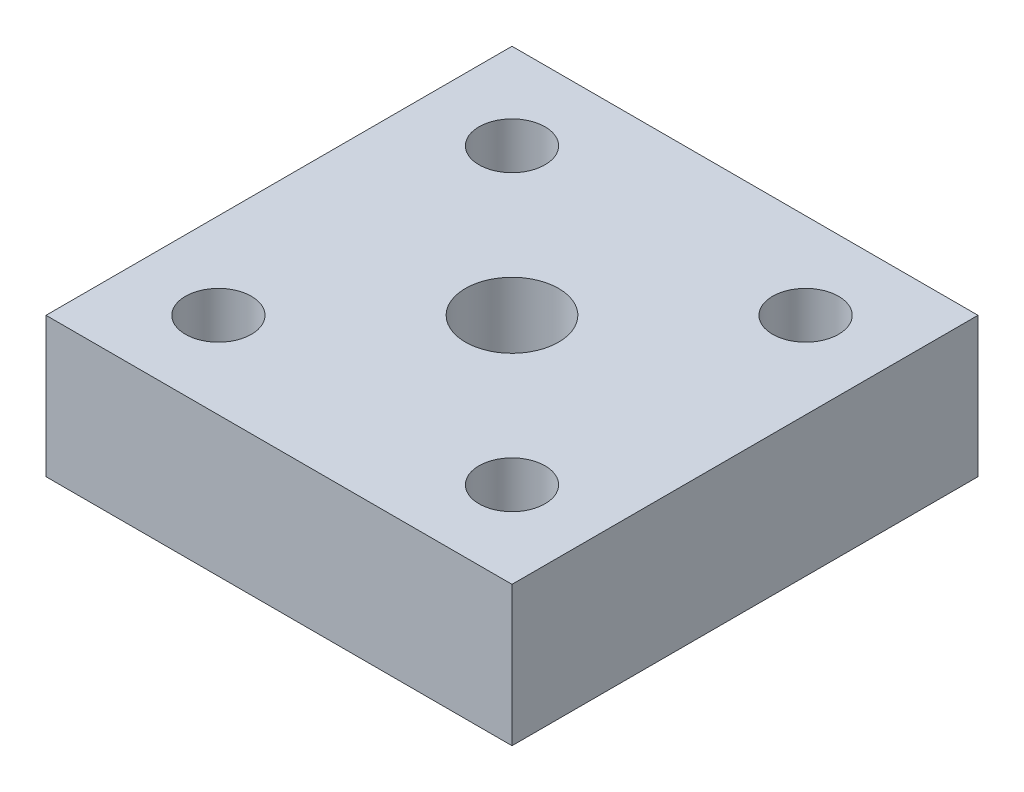
ISO-10303-21;
HEADER;
FILE_DESCRIPTION(('STEP AP214'),'2;1');
FILE_NAME('part.step','',(''),(''),'','','');
FILE_SCHEMA(('AUTOMOTIVE_DESIGN { 1 0 10303 214 1 1 1 1 }'));
ENDSEC;
DATA;
#1=APPLICATION_CONTEXT('core data for automotive mechanical design processes');
#2=APPLICATION_PROTOCOL_DEFINITION('international standard','automotive_design',2000,#1);
#3=PRODUCT_CONTEXT('',#1,'mechanical');
#4=PRODUCT('Part','Part','',(#3));
#5=PRODUCT_RELATED_PRODUCT_CATEGORY('part','',(#4));
#6=PRODUCT_DEFINITION_FORMATION('','',#4);
#7=PRODUCT_DEFINITION_CONTEXT('part definition',#1,'design');
#8=PRODUCT_DEFINITION('design','',#6,#7);
#9=PRODUCT_DEFINITION_SHAPE('','',#8);
#10=(LENGTH_UNIT() NAMED_UNIT(*) SI_UNIT(.MILLI.,.METRE.));
#11=(NAMED_UNIT(*) PLANE_ANGLE_UNIT() SI_UNIT($,.RADIAN.));
#12=(NAMED_UNIT(*) SI_UNIT($,.STERADIAN.) SOLID_ANGLE_UNIT());
#13=UNCERTAINTY_MEASURE_WITH_UNIT(LENGTH_MEASURE(1.E-05),#10,'distance_accuracy_value','');
#14=(GEOMETRIC_REPRESENTATION_CONTEXT(3) GLOBAL_UNCERTAINTY_ASSIGNED_CONTEXT((#13)) GLOBAL_UNIT_ASSIGNED_CONTEXT((#10,
#11,#12)) REPRESENTATION_CONTEXT('',''));
#15=CARTESIAN_POINT('',(0.,0.,0.));
#16=DIRECTION('',(0.,0.,1.));
#17=DIRECTION('',(1.,0.,0.));
#18=AXIS2_PLACEMENT_3D('',#15,#16,#17);
#19=CARTESIAN_POINT('',(0.,19.05,0.));
#20=DIRECTION('',(0.,1.,0.));
#21=DIRECTION('',(0.,0.,1.));
#22=AXIS2_PLACEMENT_3D('',#19,#20,#21);
#23=PLANE('',#22);
#24=CARTESIAN_POINT('',(-24.4481664723032,19.05,31.8643));
#25=DIRECTION('',(0.,1.,0.));
#26=DIRECTION('',(0.,0.,1.));
#27=AXIS2_PLACEMENT_3D('',#24,#25,#26);
#28=CIRCLE('',#27,4.4958);
#29=CARTESIAN_POINT('',(-24.4481664723032,19.05,27.3685));
#30=VERTEX_POINT('',#29);
#31=EDGE_CURVE('E155',#30,#30,#28,.T.);
#32=ORIENTED_EDGE('',*,*,#31,.F.);
#33=EDGE_LOOP('',(#32));
#34=FACE_BOUND('',#33,.T.);
#35=CARTESIAN_POINT('',(15.5568335276968,19.05,31.8643));
#36=DIRECTION('',(0.,1.,0.));
#37=DIRECTION('',(0.,0.,1.));
#38=AXIS2_PLACEMENT_3D('',#35,#36,#37);
#39=CIRCLE('',#38,4.4958);
#40=CARTESIAN_POINT('',(15.5568335276968,19.05,27.3685));
#41=VERTEX_POINT('',#40);
#42=EDGE_CURVE('E159',#41,#41,#39,.T.);
#43=ORIENTED_EDGE('',*,*,#42,.F.);
#44=EDGE_LOOP('',(#43));
#45=FACE_BOUND('',#44,.T.);
#46=CARTESIAN_POINT('',(15.5568335276968,19.05,-8.14069999999999));
#47=DIRECTION('',(0.,1.,0.));
#48=DIRECTION('',(0.,0.,1.));
#49=AXIS2_PLACEMENT_3D('',#46,#47,#48);
#50=CIRCLE('',#49,4.4958);
#51=CARTESIAN_POINT('',(15.5568335276968,19.05,-12.6365));
#52=VERTEX_POINT('',#51);
#53=EDGE_CURVE('E169',#52,#52,#50,.T.);
#54=ORIENTED_EDGE('',*,*,#53,.F.);
#55=EDGE_LOOP('',(#54));
#56=FACE_BOUND('',#55,.T.);
#57=CARTESIAN_POINT('',(-24.4481664723032,19.05,-8.14069999999999));
#58=DIRECTION('',(0.,1.,0.));
#59=DIRECTION('',(0.,0.,1.));
#60=AXIS2_PLACEMENT_3D('',#57,#58,#59);
#61=CIRCLE('',#60,4.4958);
#62=CARTESIAN_POINT('',(-24.4481664723032,19.05,-12.6365));
#63=VERTEX_POINT('',#62);
#64=EDGE_CURVE('E137',#63,#63,#61,.T.);
#65=ORIENTED_EDGE('',*,*,#64,.F.);
#66=EDGE_LOOP('',(#65));
#67=FACE_BOUND('',#66,.T.);
#68=DIRECTION('',(0.,0.,1.));
#69=VECTOR('',#68,1.);
#70=CARTESIAN_POINT('',(-36.1956664723032,19.05,-19.8882));
#71=LINE('',#70,#69);
#72=CARTESIAN_POINT('',(-36.1956664723032,19.05,-19.8882));
#73=VERTEX_POINT('',#72);
#74=CARTESIAN_POINT('',(-36.1956664723032,19.05,43.6118));
#75=VERTEX_POINT('',#74);
#76=EDGE_CURVE('E98',#73,#75,#71,.T.);
#77=ORIENTED_EDGE('',*,*,#76,.T.);
#78=DIRECTION('',(1.,0.,0.));
#79=VECTOR('',#78,1.);
#80=CARTESIAN_POINT('',(-36.1956664723032,19.05,43.6118));
#81=LINE('',#80,#79);
#82=CARTESIAN_POINT('',(27.3043335276968,19.05,43.6118));
#83=VERTEX_POINT('',#82);
#84=EDGE_CURVE('E91',#75,#83,#81,.T.);
#85=ORIENTED_EDGE('',*,*,#84,.T.);
#86=DIRECTION('',(0.,0.,-1.));
#87=VECTOR('',#86,1.);
#88=CARTESIAN_POINT('',(27.3043335276968,19.05,-19.8882));
#89=LINE('',#88,#87);
#90=CARTESIAN_POINT('',(27.3043335276968,19.05,-19.8882));
#91=VERTEX_POINT('',#90);
#92=EDGE_CURVE('E96',#83,#91,#89,.T.);
#93=ORIENTED_EDGE('',*,*,#92,.T.);
#94=DIRECTION('',(-1.,0.,0.));
#95=VECTOR('',#94,1.);
#96=CARTESIAN_POINT('',(-36.1956664723032,19.05,-19.8882));
#97=LINE('',#96,#95);
#98=EDGE_CURVE('E64',#91,#73,#97,.T.);
#99=ORIENTED_EDGE('',*,*,#98,.T.);
#100=EDGE_LOOP('',(#77,#85,#93,#99));
#101=FACE_BOUND('',#100,.T.);
#102=CARTESIAN_POINT('',(-4.4456664723032,19.05,11.8618));
#103=DIRECTION('',(0.,1.,0.));
#104=DIRECTION('',(0.,0.,1.));
#105=AXIS2_PLACEMENT_3D('',#102,#103,#104);
#106=CIRCLE('',#105,6.35);
#107=CARTESIAN_POINT('',(-4.4456664723032,19.05,5.51180000000001));
#108=VERTEX_POINT('',#107);
#109=EDGE_CURVE('E119',#108,#108,#106,.T.);
#110=ORIENTED_EDGE('',*,*,#109,.F.);
#111=EDGE_LOOP('',(#110));
#112=FACE_BOUND('',#111,.T.);
#113=ADVANCED_FACE('F44',(#34,#45,#56,#67,#101,#112),#23,.T.);
#114=CARTESIAN_POINT('',(0.,0.,0.));
#115=DIRECTION('',(0.,1.,0.));
#116=DIRECTION('',(0.,0.,1.));
#117=AXIS2_PLACEMENT_3D('',#114,#115,#116);
#118=PLANE('',#117);
#119=CARTESIAN_POINT('',(-24.4481664723032,0.,31.8643));
#120=DIRECTION('',(0.,1.,0.));
#121=DIRECTION('',(0.,0.,1.));
#122=AXIS2_PLACEMENT_3D('',#119,#120,#121);
#123=CIRCLE('',#122,4.4958);
#124=CARTESIAN_POINT('',(-24.4481664723032,0.,27.3685));
#125=VERTEX_POINT('',#124);
#126=EDGE_CURVE('E156',#125,#125,#123,.T.);
#127=ORIENTED_EDGE('',*,*,#126,.T.);
#128=EDGE_LOOP('',(#127));
#129=FACE_BOUND('',#128,.T.);
#130=CARTESIAN_POINT('',(15.5568335276968,0.,31.8643));
#131=DIRECTION('',(0.,1.,0.));
#132=DIRECTION('',(0.,0.,1.));
#133=AXIS2_PLACEMENT_3D('',#130,#131,#132);
#134=CIRCLE('',#133,4.4958);
#135=CARTESIAN_POINT('',(15.5568335276968,0.,27.3685));
#136=VERTEX_POINT('',#135);
#137=EDGE_CURVE('E163',#136,#136,#134,.T.);
#138=ORIENTED_EDGE('',*,*,#137,.T.);
#139=EDGE_LOOP('',(#138));
#140=FACE_BOUND('',#139,.T.);
#141=CARTESIAN_POINT('',(15.5568335276968,0.,-8.14069999999999));
#142=DIRECTION('',(0.,1.,0.));
#143=DIRECTION('',(0.,0.,1.));
#144=AXIS2_PLACEMENT_3D('',#141,#142,#143);
#145=CIRCLE('',#144,4.4958);
#146=CARTESIAN_POINT('',(15.5568335276968,0.,-12.6365));
#147=VERTEX_POINT('',#146);
#148=EDGE_CURVE('E146',#147,#147,#145,.T.);
#149=ORIENTED_EDGE('',*,*,#148,.T.);
#150=EDGE_LOOP('',(#149));
#151=FACE_BOUND('',#150,.T.);
#152=CARTESIAN_POINT('',(-24.4481664723032,0.,-8.14069999999999));
#153=DIRECTION('',(0.,1.,0.));
#154=DIRECTION('',(0.,0.,1.));
#155=AXIS2_PLACEMENT_3D('',#152,#153,#154);
#156=CIRCLE('',#155,4.4958);
#157=CARTESIAN_POINT('',(-24.4481664723032,0.,-12.6365));
#158=VERTEX_POINT('',#157);
#159=EDGE_CURVE('E145',#158,#158,#156,.T.);
#160=ORIENTED_EDGE('',*,*,#159,.T.);
#161=EDGE_LOOP('',(#160));
#162=FACE_BOUND('',#161,.T.);
#163=DIRECTION('',(0.,0.,1.));
#164=VECTOR('',#163,1.);
#165=CARTESIAN_POINT('',(-36.1956664723032,0.,-19.8882));
#166=LINE('',#165,#164);
#167=CARTESIAN_POINT('',(-36.1956664723032,0.,-19.8882));
#168=VERTEX_POINT('',#167);
#169=CARTESIAN_POINT('',(-36.1956664723032,0.,43.6118));
#170=VERTEX_POINT('',#169);
#171=EDGE_CURVE('E111',#168,#170,#166,.T.);
#172=ORIENTED_EDGE('',*,*,#171,.F.);
#173=DIRECTION('',(-1.,0.,0.));
#174=VECTOR('',#173,1.);
#175=CARTESIAN_POINT('',(-36.1956664723032,0.,-19.8882));
#176=LINE('',#175,#174);
#177=CARTESIAN_POINT('',(27.3043335276968,0.,-19.8882));
#178=VERTEX_POINT('',#177);
#179=EDGE_CURVE('E88',#178,#168,#176,.T.);
#180=ORIENTED_EDGE('',*,*,#179,.F.);
#181=DIRECTION('',(0.,0.,-1.));
#182=VECTOR('',#181,1.);
#183=CARTESIAN_POINT('',(27.3043335276968,0.,-19.8882));
#184=LINE('',#183,#182);
#185=CARTESIAN_POINT('',(27.3043335276968,0.,43.6118));
#186=VERTEX_POINT('',#185);
#187=EDGE_CURVE('E78',#186,#178,#184,.T.);
#188=ORIENTED_EDGE('',*,*,#187,.F.);
#189=DIRECTION('',(1.,0.,0.));
#190=VECTOR('',#189,1.);
#191=CARTESIAN_POINT('',(-36.1956664723032,0.,43.6118));
#192=LINE('',#191,#190);
#193=EDGE_CURVE('E103',#170,#186,#192,.T.);
#194=ORIENTED_EDGE('',*,*,#193,.F.);
#195=EDGE_LOOP('',(#172,#180,#188,#194));
#196=FACE_BOUND('',#195,.T.);
#197=CARTESIAN_POINT('',(-4.4456664723032,0.,11.8618));
#198=DIRECTION('',(0.,1.,0.));
#199=DIRECTION('',(0.,0.,1.));
#200=AXIS2_PLACEMENT_3D('',#197,#198,#199);
#201=CIRCLE('',#200,6.35);
#202=CARTESIAN_POINT('',(-4.4456664723032,0.,5.51180000000001));
#203=VERTEX_POINT('',#202);
#204=EDGE_CURVE('E138',#203,#203,#201,.T.);
#205=ORIENTED_EDGE('',*,*,#204,.T.);
#206=EDGE_LOOP('',(#205));
#207=FACE_BOUND('',#206,.T.);
#208=ADVANCED_FACE('F132',(#129,#140,#151,#162,#196,#207),#118,.F.);
#209=CARTESIAN_POINT('',(-36.1956664723032,19.05,-19.8882));
#210=DIRECTION('',(1.,0.,0.));
#211=DIRECTION('',(0.,0.,-1.));
#212=AXIS2_PLACEMENT_3D('',#209,#210,#211);
#213=PLANE('',#212);
#214=ORIENTED_EDGE('',*,*,#171,.T.);
#215=DIRECTION('',(0.,-1.,0.));
#216=VECTOR('',#215,1.);
#217=CARTESIAN_POINT('',(-36.1956664723032,19.05,43.6118));
#218=LINE('',#217,#216);
#219=EDGE_CURVE('E11',#75,#170,#218,.T.);
#220=ORIENTED_EDGE('',*,*,#219,.F.);
#221=ORIENTED_EDGE('',*,*,#76,.F.);
#222=DIRECTION('',(0.,-1.,0.));
#223=VECTOR('',#222,1.);
#224=CARTESIAN_POINT('',(-36.1956664723032,19.05,-19.8882));
#225=LINE('',#224,#223);
#226=EDGE_CURVE('E109',#73,#168,#225,.T.);
#227=ORIENTED_EDGE('',*,*,#226,.T.);
#228=EDGE_LOOP('',(#214,#220,#221,#227));
#229=FACE_BOUND('',#228,.T.);
#230=ADVANCED_FACE('F50',(#229),#213,.F.);
#231=CARTESIAN_POINT('',(-36.1956664723032,19.05,43.6118));
#232=DIRECTION('',(0.,0.,-1.));
#233=DIRECTION('',(-1.,0.,0.));
#234=AXIS2_PLACEMENT_3D('',#231,#232,#233);
#235=PLANE('',#234);
#236=ORIENTED_EDGE('',*,*,#193,.T.);
#237=DIRECTION('',(0.,-1.,0.));
#238=VECTOR('',#237,1.);
#239=CARTESIAN_POINT('',(27.3043335276968,19.05,43.6118));
#240=LINE('',#239,#238);
#241=EDGE_CURVE('E54',#83,#186,#240,.T.);
#242=ORIENTED_EDGE('',*,*,#241,.F.);
#243=ORIENTED_EDGE('',*,*,#84,.F.);
#244=ORIENTED_EDGE('',*,*,#219,.T.);
#245=EDGE_LOOP('',(#236,#242,#243,#244));
#246=FACE_BOUND('',#245,.T.);
#247=ADVANCED_FACE('F105',(#246),#235,.F.);
#248=CARTESIAN_POINT('',(27.3043335276968,19.05,-19.8882));
#249=DIRECTION('',(-1.,0.,0.));
#250=DIRECTION('',(0.,0.,1.));
#251=AXIS2_PLACEMENT_3D('',#248,#249,#250);
#252=PLANE('',#251);
#253=ORIENTED_EDGE('',*,*,#187,.T.);
#254=DIRECTION('',(0.,-1.,0.));
#255=VECTOR('',#254,1.);
#256=CARTESIAN_POINT('',(27.3043335276968,19.05,-19.8882));
#257=LINE('',#256,#255);
#258=EDGE_CURVE('E104',#91,#178,#257,.T.);
#259=ORIENTED_EDGE('',*,*,#258,.F.);
#260=ORIENTED_EDGE('',*,*,#92,.F.);
#261=ORIENTED_EDGE('',*,*,#241,.T.);
#262=EDGE_LOOP('',(#253,#259,#260,#261));
#263=FACE_BOUND('',#262,.T.);
#264=ADVANCED_FACE('F106',(#263),#252,.F.);
#265=CARTESIAN_POINT('',(-36.1956664723032,19.05,-19.8882));
#266=DIRECTION('',(0.,0.,1.));
#267=DIRECTION('',(1.,0.,0.));
#268=AXIS2_PLACEMENT_3D('',#265,#266,#267);
#269=PLANE('',#268);
#270=ORIENTED_EDGE('',*,*,#179,.T.);
#271=ORIENTED_EDGE('',*,*,#226,.F.);
#272=ORIENTED_EDGE('',*,*,#98,.F.);
#273=ORIENTED_EDGE('',*,*,#258,.T.);
#274=EDGE_LOOP('',(#270,#271,#272,#273));
#275=FACE_BOUND('',#274,.T.);
#276=ADVANCED_FACE('F126',(#275),#269,.F.);
#277=CARTESIAN_POINT('',(-4.4456664723032,19.05,11.8618));
#278=DIRECTION('',(0.,-1.,0.));
#279=DIRECTION('',(0.,0.,-1.));
#280=AXIS2_PLACEMENT_3D('',#277,#278,#279);
#281=CYLINDRICAL_SURFACE('',#280,6.35);
#282=CARTESIAN_POINT('',(-4.4456664723032,19.05,5.51180000000001));
#283=CARTESIAN_POINT('',(-4.4456664723032,18.8515625,5.51180000000001));
#284=CARTESIAN_POINT('',(-4.4456664723032,18.653125,5.51180000000001));
#285=CARTESIAN_POINT('',(-4.4456664723032,18.25625,5.51180000000001));
#286=CARTESIAN_POINT('',(-4.4456664723032,18.0578125,5.51180000000001));
#287=CARTESIAN_POINT('',(-4.4456664723032,17.6609375,5.51180000000001));
#288=CARTESIAN_POINT('',(-4.4456664723032,17.4625,5.51180000000001));
#289=CARTESIAN_POINT('',(-4.4456664723032,17.065625,5.51180000000001));
#290=CARTESIAN_POINT('',(-4.4456664723032,16.8671875,5.51180000000001));
#291=CARTESIAN_POINT('',(-4.4456664723032,16.4703125,5.51180000000001));
#292=CARTESIAN_POINT('',(-4.4456664723032,16.271875,5.51180000000001));
#293=CARTESIAN_POINT('',(-4.4456664723032,15.875,5.51180000000001));
#294=CARTESIAN_POINT('',(-4.4456664723032,15.6765625,5.51180000000001));
#295=CARTESIAN_POINT('',(-4.4456664723032,15.2796875,5.51180000000001));
#296=CARTESIAN_POINT('',(-4.4456664723032,15.08125,5.51180000000001));
#297=CARTESIAN_POINT('',(-4.4456664723032,14.684375,5.51180000000001));
#298=CARTESIAN_POINT('',(-4.4456664723032,14.4859375,5.51180000000001));
#299=CARTESIAN_POINT('',(-4.4456664723032,14.0890625,5.51180000000001));
#300=CARTESIAN_POINT('',(-4.4456664723032,13.890625,5.51180000000001));
#301=CARTESIAN_POINT('',(-4.4456664723032,13.49375,5.51180000000001));
#302=CARTESIAN_POINT('',(-4.4456664723032,13.2953125,5.51180000000001));
#303=CARTESIAN_POINT('',(-4.4456664723032,12.8984375,5.51180000000001));
#304=CARTESIAN_POINT('',(-4.4456664723032,12.7,5.51180000000001));
#305=CARTESIAN_POINT('',(-4.4456664723032,12.303125,5.51180000000001));
#306=CARTESIAN_POINT('',(-4.4456664723032,12.1046875,5.51180000000001));
#307=CARTESIAN_POINT('',(-4.4456664723032,11.7078125,5.51180000000001));
#308=CARTESIAN_POINT('',(-4.4456664723032,11.509375,5.51180000000001));
#309=CARTESIAN_POINT('',(-4.4456664723032,11.1125,5.51180000000001));
#310=CARTESIAN_POINT('',(-4.4456664723032,10.9140625,5.51180000000001));
#311=CARTESIAN_POINT('',(-4.4456664723032,10.5171875,5.51180000000001));
#312=CARTESIAN_POINT('',(-4.4456664723032,10.31875,5.51180000000001));
#313=CARTESIAN_POINT('',(-4.4456664723032,9.921875,5.51180000000001));
#314=CARTESIAN_POINT('',(-4.4456664723032,9.7234375,5.51180000000001));
#315=CARTESIAN_POINT('',(-4.4456664723032,9.3265625,5.51180000000001));
#316=CARTESIAN_POINT('',(-4.4456664723032,9.128125,5.51180000000001));
#317=CARTESIAN_POINT('',(-4.4456664723032,8.73125,5.51180000000001));
#318=CARTESIAN_POINT('',(-4.4456664723032,8.5328125,5.51180000000001));
#319=CARTESIAN_POINT('',(-4.4456664723032,8.1359375,5.51180000000001));
#320=CARTESIAN_POINT('',(-4.4456664723032,7.9375,5.51180000000001));
#321=CARTESIAN_POINT('',(-4.4456664723032,7.540625,5.51180000000001));
#322=CARTESIAN_POINT('',(-4.4456664723032,7.3421875,5.51180000000001));
#323=CARTESIAN_POINT('',(-4.4456664723032,6.9453125,5.51180000000001));
#324=CARTESIAN_POINT('',(-4.4456664723032,6.746875,5.51180000000001));
#325=CARTESIAN_POINT('',(-4.4456664723032,6.35,5.51180000000001));
#326=CARTESIAN_POINT('',(-4.4456664723032,6.1515625,5.51180000000001));
#327=CARTESIAN_POINT('',(-4.4456664723032,5.7546875,5.51180000000001));
#328=CARTESIAN_POINT('',(-4.4456664723032,5.55625,5.51180000000001));
#329=CARTESIAN_POINT('',(-4.4456664723032,5.159375,5.51180000000001));
#330=CARTESIAN_POINT('',(-4.4456664723032,4.9609375,5.51180000000001));
#331=CARTESIAN_POINT('',(-4.4456664723032,4.5640625,5.51180000000001));
#332=CARTESIAN_POINT('',(-4.4456664723032,4.365625,5.51180000000001));
#333=CARTESIAN_POINT('',(-4.4456664723032,3.96875,5.51180000000001));
#334=CARTESIAN_POINT('',(-4.4456664723032,3.7703125,5.51180000000001));
#335=CARTESIAN_POINT('',(-4.4456664723032,3.3734375,5.51180000000001));
#336=CARTESIAN_POINT('',(-4.4456664723032,3.175,5.51180000000001));
#337=CARTESIAN_POINT('',(-4.4456664723032,2.778125,5.51180000000001));
#338=CARTESIAN_POINT('',(-4.4456664723032,2.5796875,5.51180000000001));
#339=CARTESIAN_POINT('',(-4.4456664723032,2.1828125,5.51180000000001));
#340=CARTESIAN_POINT('',(-4.4456664723032,1.984375,5.51180000000001));
#341=CARTESIAN_POINT('',(-4.4456664723032,1.5875,5.51180000000001));
#342=CARTESIAN_POINT('',(-4.4456664723032,1.3890625,5.51180000000001));
#343=CARTESIAN_POINT('',(-4.4456664723032,0.992187500000001,5.51180000000001));
#344=CARTESIAN_POINT('',(-4.4456664723032,0.793750000000001,5.51180000000001));
#345=CARTESIAN_POINT('',(-4.4456664723032,0.396875,5.51180000000001));
#346=CARTESIAN_POINT('',(-4.4456664723032,0.1984375,5.51180000000001));
#347=CARTESIAN_POINT('',(-4.4456664723032,0.,5.51180000000001));
#348=B_SPLINE_CURVE_WITH_KNOTS('',3,(#282,#283,#284,#285,#286,#287,#288,#289,#290,#291,#292,
#293,#294,#295,#296,#297,#298,#299,#300,#301,#302,#303,#304,#305,#306,#307,#308,#309,#310,#311,
#312,#313,#314,#315,#316,#317,#318,#319,#320,#321,#322,#323,#324,#325,#326,#327,#328,#329,#330,
#331,#332,#333,#334,#335,#336,#337,#338,#339,#340,#341,#342,#343,#344,#345,#346,#347),
.UNSPECIFIED.,.F.,.F.,(4,2,2,2,2,2,2,2,2,2,2,2,2,2,2,2,2,2,2,2,2,2,2,2,2,2,2,2,2,2,2,2,4),(0.,
0.5953125,1.190625,1.7859375,2.38125,2.9765625,3.571875,4.1671875,4.7625,5.3578125,5.953125,
6.5484375,7.14375,7.7390625,8.334375,8.9296875,9.525,10.1203125,10.715625,11.3109375,11.90625,
12.5015625,13.096875,13.6921875,14.2875,14.8828125,15.478125,16.0734375,16.66875,17.2640625,
17.859375,18.4546875,19.05),.UNSPECIFIED.);
#349=EDGE_CURVE('BSEAM193',#108,#203,#348,.T.);
#350=ORIENTED_EDGE('',*,*,#109,.T.);
#351=ORIENTED_EDGE('',*,*,#204,.F.);
#352=ORIENTED_EDGE('',*,*,#349,.T.);
#353=ORIENTED_EDGE('',*,*,#349,.F.);
#354=EDGE_LOOP('',(#350,#352,#351,#353));
#355=FACE_BOUND('',#354,.T.);
#356=ADVANCED_FACE('F193',(#355),#281,.F.);
#357=CARTESIAN_POINT('',(-24.4481664723032,19.05,-8.14069999999999));
#358=DIRECTION('',(0.,-1.,0.));
#359=DIRECTION('',(0.,0.,-1.));
#360=AXIS2_PLACEMENT_3D('',#357,#358,#359);
#361=CYLINDRICAL_SURFACE('',#360,4.4958);
#362=CARTESIAN_POINT('',(-24.4481664723032,19.05,-12.6365));
#363=CARTESIAN_POINT('',(-24.4481664723032,18.8515625,-12.6365));
#364=CARTESIAN_POINT('',(-24.4481664723032,18.653125,-12.6365));
#365=CARTESIAN_POINT('',(-24.4481664723032,18.25625,-12.6365));
#366=CARTESIAN_POINT('',(-24.4481664723032,18.0578125,-12.6365));
#367=CARTESIAN_POINT('',(-24.4481664723032,17.6609375,-12.6365));
#368=CARTESIAN_POINT('',(-24.4481664723032,17.4625,-12.6365));
#369=CARTESIAN_POINT('',(-24.4481664723032,17.065625,-12.6365));
#370=CARTESIAN_POINT('',(-24.4481664723032,16.8671875,-12.6365));
#371=CARTESIAN_POINT('',(-24.4481664723032,16.4703125,-12.6365));
#372=CARTESIAN_POINT('',(-24.4481664723032,16.271875,-12.6365));
#373=CARTESIAN_POINT('',(-24.4481664723032,15.875,-12.6365));
#374=CARTESIAN_POINT('',(-24.4481664723032,15.6765625,-12.6365));
#375=CARTESIAN_POINT('',(-24.4481664723032,15.2796875,-12.6365));
#376=CARTESIAN_POINT('',(-24.4481664723032,15.08125,-12.6365));
#377=CARTESIAN_POINT('',(-24.4481664723032,14.684375,-12.6365));
#378=CARTESIAN_POINT('',(-24.4481664723032,14.4859375,-12.6365));
#379=CARTESIAN_POINT('',(-24.4481664723032,14.0890625,-12.6365));
#380=CARTESIAN_POINT('',(-24.4481664723032,13.890625,-12.6365));
#381=CARTESIAN_POINT('',(-24.4481664723032,13.49375,-12.6365));
#382=CARTESIAN_POINT('',(-24.4481664723032,13.2953125,-12.6365));
#383=CARTESIAN_POINT('',(-24.4481664723032,12.8984375,-12.6365));
#384=CARTESIAN_POINT('',(-24.4481664723032,12.7,-12.6365));
#385=CARTESIAN_POINT('',(-24.4481664723032,12.303125,-12.6365));
#386=CARTESIAN_POINT('',(-24.4481664723032,12.1046875,-12.6365));
#387=CARTESIAN_POINT('',(-24.4481664723032,11.7078125,-12.6365));
#388=CARTESIAN_POINT('',(-24.4481664723032,11.509375,-12.6365));
#389=CARTESIAN_POINT('',(-24.4481664723032,11.1125,-12.6365));
#390=CARTESIAN_POINT('',(-24.4481664723032,10.9140625,-12.6365));
#391=CARTESIAN_POINT('',(-24.4481664723032,10.5171875,-12.6365));
#392=CARTESIAN_POINT('',(-24.4481664723032,10.31875,-12.6365));
#393=CARTESIAN_POINT('',(-24.4481664723032,9.921875,-12.6365));
#394=CARTESIAN_POINT('',(-24.4481664723032,9.7234375,-12.6365));
#395=CARTESIAN_POINT('',(-24.4481664723032,9.3265625,-12.6365));
#396=CARTESIAN_POINT('',(-24.4481664723032,9.128125,-12.6365));
#397=CARTESIAN_POINT('',(-24.4481664723032,8.73125,-12.6365));
#398=CARTESIAN_POINT('',(-24.4481664723032,8.5328125,-12.6365));
#399=CARTESIAN_POINT('',(-24.4481664723032,8.1359375,-12.6365));
#400=CARTESIAN_POINT('',(-24.4481664723032,7.9375,-12.6365));
#401=CARTESIAN_POINT('',(-24.4481664723032,7.540625,-12.6365));
#402=CARTESIAN_POINT('',(-24.4481664723032,7.3421875,-12.6365));
#403=CARTESIAN_POINT('',(-24.4481664723032,6.9453125,-12.6365));
#404=CARTESIAN_POINT('',(-24.4481664723032,6.746875,-12.6365));
#405=CARTESIAN_POINT('',(-24.4481664723032,6.35,-12.6365));
#406=CARTESIAN_POINT('',(-24.4481664723032,6.1515625,-12.6365));
#407=CARTESIAN_POINT('',(-24.4481664723032,5.7546875,-12.6365));
#408=CARTESIAN_POINT('',(-24.4481664723032,5.55625,-12.6365));
#409=CARTESIAN_POINT('',(-24.4481664723032,5.159375,-12.6365));
#410=CARTESIAN_POINT('',(-24.4481664723032,4.9609375,-12.6365));
#411=CARTESIAN_POINT('',(-24.4481664723032,4.5640625,-12.6365));
#412=CARTESIAN_POINT('',(-24.4481664723032,4.365625,-12.6365));
#413=CARTESIAN_POINT('',(-24.4481664723032,3.96875,-12.6365));
#414=CARTESIAN_POINT('',(-24.4481664723032,3.7703125,-12.6365));
#415=CARTESIAN_POINT('',(-24.4481664723032,3.3734375,-12.6365));
#416=CARTESIAN_POINT('',(-24.4481664723032,3.175,-12.6365));
#417=CARTESIAN_POINT('',(-24.4481664723032,2.778125,-12.6365));
#418=CARTESIAN_POINT('',(-24.4481664723032,2.5796875,-12.6365));
#419=CARTESIAN_POINT('',(-24.4481664723032,2.1828125,-12.6365));
#420=CARTESIAN_POINT('',(-24.4481664723032,1.984375,-12.6365));
#421=CARTESIAN_POINT('',(-24.4481664723032,1.5875,-12.6365));
#422=CARTESIAN_POINT('',(-24.4481664723032,1.3890625,-12.6365));
#423=CARTESIAN_POINT('',(-24.4481664723032,0.992187500000001,-12.6365));
#424=CARTESIAN_POINT('',(-24.4481664723032,0.793750000000001,-12.6365));
#425=CARTESIAN_POINT('',(-24.4481664723032,0.396875,-12.6365));
#426=CARTESIAN_POINT('',(-24.4481664723032,0.1984375,-12.6365));
#427=CARTESIAN_POINT('',(-24.4481664723032,0.,-12.6365));
#428=B_SPLINE_CURVE_WITH_KNOTS('',3,(#362,#363,#364,#365,#366,#367,#368,#369,#370,#371,#372,
#373,#374,#375,#376,#377,#378,#379,#380,#381,#382,#383,#384,#385,#386,#387,#388,#389,#390,#391,
#392,#393,#394,#395,#396,#397,#398,#399,#400,#401,#402,#403,#404,#405,#406,#407,#408,#409,#410,
#411,#412,#413,#414,#415,#416,#417,#418,#419,#420,#421,#422,#423,#424,#425,#426,#427),
.UNSPECIFIED.,.F.,.F.,(4,2,2,2,2,2,2,2,2,2,2,2,2,2,2,2,2,2,2,2,2,2,2,2,2,2,2,2,2,2,2,2,4),(0.,
0.595312499999997,1.190625,1.7859375,2.38125,2.9765625,3.571875,4.1671875,4.7625,5.3578125,
5.953125,6.5484375,7.14375,7.7390625,8.334375,8.9296875,9.525,10.1203125,10.715625,11.3109375,
11.90625,12.5015625,13.096875,13.6921875,14.2875,14.8828125,15.478125,16.0734375,16.66875,
17.2640625,17.859375,18.4546875,19.05),.UNSPECIFIED.);
#429=EDGE_CURVE('BSEAM182',#63,#158,#428,.T.);
#430=ORIENTED_EDGE('',*,*,#64,.T.);
#431=ORIENTED_EDGE('',*,*,#159,.F.);
#432=ORIENTED_EDGE('',*,*,#429,.T.);
#433=ORIENTED_EDGE('',*,*,#429,.F.);
#434=EDGE_LOOP('',(#430,#432,#431,#433));
#435=FACE_BOUND('',#434,.T.);
#436=ADVANCED_FACE('F182',(#435),#361,.F.);
#437=CARTESIAN_POINT('',(15.5568335276968,19.05,-8.14069999999999));
#438=DIRECTION('',(0.,-1.,0.));
#439=DIRECTION('',(0.,0.,-1.));
#440=AXIS2_PLACEMENT_3D('',#437,#438,#439);
#441=CYLINDRICAL_SURFACE('',#440,4.4958);
#442=CARTESIAN_POINT('',(15.5568335276968,19.05,-12.6365));
#443=CARTESIAN_POINT('',(15.5568335276968,18.8515625,-12.6365));
#444=CARTESIAN_POINT('',(15.5568335276968,18.653125,-12.6365));
#445=CARTESIAN_POINT('',(15.5568335276968,18.25625,-12.6365));
#446=CARTESIAN_POINT('',(15.5568335276968,18.0578125,-12.6365));
#447=CARTESIAN_POINT('',(15.5568335276968,17.6609375,-12.6365));
#448=CARTESIAN_POINT('',(15.5568335276968,17.4625,-12.6365));
#449=CARTESIAN_POINT('',(15.5568335276968,17.065625,-12.6365));
#450=CARTESIAN_POINT('',(15.5568335276968,16.8671875,-12.6365));
#451=CARTESIAN_POINT('',(15.5568335276968,16.4703125,-12.6365));
#452=CARTESIAN_POINT('',(15.5568335276968,16.271875,-12.6365));
#453=CARTESIAN_POINT('',(15.5568335276968,15.875,-12.6365));
#454=CARTESIAN_POINT('',(15.5568335276968,15.6765625,-12.6365));
#455=CARTESIAN_POINT('',(15.5568335276968,15.2796875,-12.6365));
#456=CARTESIAN_POINT('',(15.5568335276968,15.08125,-12.6365));
#457=CARTESIAN_POINT('',(15.5568335276968,14.684375,-12.6365));
#458=CARTESIAN_POINT('',(15.5568335276968,14.4859375,-12.6365));
#459=CARTESIAN_POINT('',(15.5568335276968,14.0890625,-12.6365));
#460=CARTESIAN_POINT('',(15.5568335276968,13.890625,-12.6365));
#461=CARTESIAN_POINT('',(15.5568335276968,13.49375,-12.6365));
#462=CARTESIAN_POINT('',(15.5568335276968,13.2953125,-12.6365));
#463=CARTESIAN_POINT('',(15.5568335276968,12.8984375,-12.6365));
#464=CARTESIAN_POINT('',(15.5568335276968,12.7,-12.6365));
#465=CARTESIAN_POINT('',(15.5568335276968,12.303125,-12.6365));
#466=CARTESIAN_POINT('',(15.5568335276968,12.1046875,-12.6365));
#467=CARTESIAN_POINT('',(15.5568335276968,11.7078125,-12.6365));
#468=CARTESIAN_POINT('',(15.5568335276968,11.509375,-12.6365));
#469=CARTESIAN_POINT('',(15.5568335276968,11.1125,-12.6365));
#470=CARTESIAN_POINT('',(15.5568335276968,10.9140625,-12.6365));
#471=CARTESIAN_POINT('',(15.5568335276968,10.5171875,-12.6365));
#472=CARTESIAN_POINT('',(15.5568335276968,10.31875,-12.6365));
#473=CARTESIAN_POINT('',(15.5568335276968,9.921875,-12.6365));
#474=CARTESIAN_POINT('',(15.5568335276968,9.7234375,-12.6365));
#475=CARTESIAN_POINT('',(15.5568335276968,9.3265625,-12.6365));
#476=CARTESIAN_POINT('',(15.5568335276968,9.128125,-12.6365));
#477=CARTESIAN_POINT('',(15.5568335276968,8.73125,-12.6365));
#478=CARTESIAN_POINT('',(15.5568335276968,8.5328125,-12.6365));
#479=CARTESIAN_POINT('',(15.5568335276968,8.1359375,-12.6365));
#480=CARTESIAN_POINT('',(15.5568335276968,7.9375,-12.6365));
#481=CARTESIAN_POINT('',(15.5568335276968,7.540625,-12.6365));
#482=CARTESIAN_POINT('',(15.5568335276968,7.3421875,-12.6365));
#483=CARTESIAN_POINT('',(15.5568335276968,6.9453125,-12.6365));
#484=CARTESIAN_POINT('',(15.5568335276968,6.746875,-12.6365));
#485=CARTESIAN_POINT('',(15.5568335276968,6.35,-12.6365));
#486=CARTESIAN_POINT('',(15.5568335276968,6.1515625,-12.6365));
#487=CARTESIAN_POINT('',(15.5568335276968,5.7546875,-12.6365));
#488=CARTESIAN_POINT('',(15.5568335276968,5.55625,-12.6365));
#489=CARTESIAN_POINT('',(15.5568335276968,5.159375,-12.6365));
#490=CARTESIAN_POINT('',(15.5568335276968,4.9609375,-12.6365));
#491=CARTESIAN_POINT('',(15.5568335276968,4.5640625,-12.6365));
#492=CARTESIAN_POINT('',(15.5568335276968,4.365625,-12.6365));
#493=CARTESIAN_POINT('',(15.5568335276968,3.96875,-12.6365));
#494=CARTESIAN_POINT('',(15.5568335276968,3.7703125,-12.6365));
#495=CARTESIAN_POINT('',(15.5568335276968,3.3734375,-12.6365));
#496=CARTESIAN_POINT('',(15.5568335276968,3.175,-12.6365));
#497=CARTESIAN_POINT('',(15.5568335276968,2.778125,-12.6365));
#498=CARTESIAN_POINT('',(15.5568335276968,2.5796875,-12.6365));
#499=CARTESIAN_POINT('',(15.5568335276968,2.1828125,-12.6365));
#500=CARTESIAN_POINT('',(15.5568335276968,1.984375,-12.6365));
#501=CARTESIAN_POINT('',(15.5568335276968,1.5875,-12.6365));
#502=CARTESIAN_POINT('',(15.5568335276968,1.3890625,-12.6365));
#503=CARTESIAN_POINT('',(15.5568335276968,0.992187500000001,-12.6365));
#504=CARTESIAN_POINT('',(15.5568335276968,0.793750000000001,-12.6365));
#505=CARTESIAN_POINT('',(15.5568335276968,0.396875,-12.6365));
#506=CARTESIAN_POINT('',(15.5568335276968,0.1984375,-12.6365));
#507=CARTESIAN_POINT('',(15.5568335276968,0.,-12.6365));
#508=B_SPLINE_CURVE_WITH_KNOTS('',3,(#442,#443,#444,#445,#446,#447,#448,#449,#450,#451,#452,
#453,#454,#455,#456,#457,#458,#459,#460,#461,#462,#463,#464,#465,#466,#467,#468,#469,#470,#471,
#472,#473,#474,#475,#476,#477,#478,#479,#480,#481,#482,#483,#484,#485,#486,#487,#488,#489,#490,
#491,#492,#493,#494,#495,#496,#497,#498,#499,#500,#501,#502,#503,#504,#505,#506,#507),
.UNSPECIFIED.,.F.,.F.,(4,2,2,2,2,2,2,2,2,2,2,2,2,2,2,2,2,2,2,2,2,2,2,2,2,2,2,2,2,2,2,2,4),(0.,
0.595312499999997,1.190625,1.7859375,2.38125,2.9765625,3.571875,4.1671875,4.7625,5.3578125,
5.953125,6.5484375,7.14375,7.7390625,8.334375,8.9296875,9.525,10.1203125,10.715625,11.3109375,
11.90625,12.5015625,13.096875,13.6921875,14.2875,14.8828125,15.478125,16.0734375,16.66875,
17.2640625,17.859375,18.4546875,19.05),.UNSPECIFIED.);
#509=EDGE_CURVE('BSEAM176',#52,#147,#508,.T.);
#510=ORIENTED_EDGE('',*,*,#53,.T.);
#511=ORIENTED_EDGE('',*,*,#148,.F.);
#512=ORIENTED_EDGE('',*,*,#509,.T.);
#513=ORIENTED_EDGE('',*,*,#509,.F.);
#514=EDGE_LOOP('',(#510,#512,#511,#513));
#515=FACE_BOUND('',#514,.T.);
#516=ADVANCED_FACE('F176',(#515),#441,.F.);
#517=CARTESIAN_POINT('',(15.5568335276968,19.05,31.8643));
#518=DIRECTION('',(0.,-1.,0.));
#519=DIRECTION('',(0.,0.,-1.));
#520=AXIS2_PLACEMENT_3D('',#517,#518,#519);
#521=CYLINDRICAL_SURFACE('',#520,4.4958);
#522=CARTESIAN_POINT('',(15.5568335276968,19.05,27.3685));
#523=CARTESIAN_POINT('',(15.5568335276968,18.8515625,27.3685));
#524=CARTESIAN_POINT('',(15.5568335276968,18.653125,27.3685));
#525=CARTESIAN_POINT('',(15.5568335276968,18.25625,27.3685));
#526=CARTESIAN_POINT('',(15.5568335276968,18.0578125,27.3685));
#527=CARTESIAN_POINT('',(15.5568335276968,17.6609375,27.3685));
#528=CARTESIAN_POINT('',(15.5568335276968,17.4625,27.3685));
#529=CARTESIAN_POINT('',(15.5568335276968,17.065625,27.3685));
#530=CARTESIAN_POINT('',(15.5568335276968,16.8671875,27.3685));
#531=CARTESIAN_POINT('',(15.5568335276968,16.4703125,27.3685));
#532=CARTESIAN_POINT('',(15.5568335276968,16.271875,27.3685));
#533=CARTESIAN_POINT('',(15.5568335276968,15.875,27.3685));
#534=CARTESIAN_POINT('',(15.5568335276968,15.6765625,27.3685));
#535=CARTESIAN_POINT('',(15.5568335276968,15.2796875,27.3685));
#536=CARTESIAN_POINT('',(15.5568335276968,15.08125,27.3685));
#537=CARTESIAN_POINT('',(15.5568335276968,14.684375,27.3685));
#538=CARTESIAN_POINT('',(15.5568335276968,14.4859375,27.3685));
#539=CARTESIAN_POINT('',(15.5568335276968,14.0890625,27.3685));
#540=CARTESIAN_POINT('',(15.5568335276968,13.890625,27.3685));
#541=CARTESIAN_POINT('',(15.5568335276968,13.49375,27.3685));
#542=CARTESIAN_POINT('',(15.5568335276968,13.2953125,27.3685));
#543=CARTESIAN_POINT('',(15.5568335276968,12.8984375,27.3685));
#544=CARTESIAN_POINT('',(15.5568335276968,12.7,27.3685));
#545=CARTESIAN_POINT('',(15.5568335276968,12.303125,27.3685));
#546=CARTESIAN_POINT('',(15.5568335276968,12.1046875,27.3685));
#547=CARTESIAN_POINT('',(15.5568335276968,11.7078125,27.3685));
#548=CARTESIAN_POINT('',(15.5568335276968,11.509375,27.3685));
#549=CARTESIAN_POINT('',(15.5568335276968,11.1125,27.3685));
#550=CARTESIAN_POINT('',(15.5568335276968,10.9140625,27.3685));
#551=CARTESIAN_POINT('',(15.5568335276968,10.5171875,27.3685));
#552=CARTESIAN_POINT('',(15.5568335276968,10.31875,27.3685));
#553=CARTESIAN_POINT('',(15.5568335276968,9.921875,27.3685));
#554=CARTESIAN_POINT('',(15.5568335276968,9.7234375,27.3685));
#555=CARTESIAN_POINT('',(15.5568335276968,9.3265625,27.3685));
#556=CARTESIAN_POINT('',(15.5568335276968,9.128125,27.3685));
#557=CARTESIAN_POINT('',(15.5568335276968,8.73125,27.3685));
#558=CARTESIAN_POINT('',(15.5568335276968,8.5328125,27.3685));
#559=CARTESIAN_POINT('',(15.5568335276968,8.1359375,27.3685));
#560=CARTESIAN_POINT('',(15.5568335276968,7.9375,27.3685));
#561=CARTESIAN_POINT('',(15.5568335276968,7.540625,27.3685));
#562=CARTESIAN_POINT('',(15.5568335276968,7.3421875,27.3685));
#563=CARTESIAN_POINT('',(15.5568335276968,6.9453125,27.3685));
#564=CARTESIAN_POINT('',(15.5568335276968,6.746875,27.3685));
#565=CARTESIAN_POINT('',(15.5568335276968,6.35,27.3685));
#566=CARTESIAN_POINT('',(15.5568335276968,6.1515625,27.3685));
#567=CARTESIAN_POINT('',(15.5568335276968,5.7546875,27.3685));
#568=CARTESIAN_POINT('',(15.5568335276968,5.55625,27.3685));
#569=CARTESIAN_POINT('',(15.5568335276968,5.159375,27.3685));
#570=CARTESIAN_POINT('',(15.5568335276968,4.9609375,27.3685));
#571=CARTESIAN_POINT('',(15.5568335276968,4.5640625,27.3685));
#572=CARTESIAN_POINT('',(15.5568335276968,4.365625,27.3685));
#573=CARTESIAN_POINT('',(15.5568335276968,3.96875,27.3685));
#574=CARTESIAN_POINT('',(15.5568335276968,3.7703125,27.3685));
#575=CARTESIAN_POINT('',(15.5568335276968,3.3734375,27.3685));
#576=CARTESIAN_POINT('',(15.5568335276968,3.175,27.3685));
#577=CARTESIAN_POINT('',(15.5568335276968,2.778125,27.3685));
#578=CARTESIAN_POINT('',(15.5568335276968,2.5796875,27.3685));
#579=CARTESIAN_POINT('',(15.5568335276968,2.1828125,27.3685));
#580=CARTESIAN_POINT('',(15.5568335276968,1.984375,27.3685));
#581=CARTESIAN_POINT('',(15.5568335276968,1.5875,27.3685));
#582=CARTESIAN_POINT('',(15.5568335276968,1.3890625,27.3685));
#583=CARTESIAN_POINT('',(15.5568335276968,0.992187500000001,27.3685));
#584=CARTESIAN_POINT('',(15.5568335276968,0.793750000000001,27.3685));
#585=CARTESIAN_POINT('',(15.5568335276968,0.396875,27.3685));
#586=CARTESIAN_POINT('',(15.5568335276968,0.1984375,27.3685));
#587=CARTESIAN_POINT('',(15.5568335276968,0.,27.3685));
#588=B_SPLINE_CURVE_WITH_KNOTS('',3,(#522,#523,#524,#525,#526,#527,#528,#529,#530,#531,#532,
#533,#534,#535,#536,#537,#538,#539,#540,#541,#542,#543,#544,#545,#546,#547,#548,#549,#550,#551,
#552,#553,#554,#555,#556,#557,#558,#559,#560,#561,#562,#563,#564,#565,#566,#567,#568,#569,#570,
#571,#572,#573,#574,#575,#576,#577,#578,#579,#580,#581,#582,#583,#584,#585,#586,#587),
.UNSPECIFIED.,.F.,.F.,(4,2,2,2,2,2,2,2,2,2,2,2,2,2,2,2,2,2,2,2,2,2,2,2,2,2,2,2,2,2,2,2,4),(0.,
0.595312499999997,1.190625,1.7859375,2.38125,2.9765625,3.571875,4.1671875,4.7625,5.3578125,
5.953125,6.5484375,7.14375,7.7390625,8.334375,8.9296875,9.525,10.1203125,10.715625,11.3109375,
11.90625,12.5015625,13.096875,13.6921875,14.2875,14.8828125,15.478125,16.0734375,16.66875,
17.2640625,17.859375,18.4546875,19.05),.UNSPECIFIED.);
#589=EDGE_CURVE('BSEAM177',#41,#136,#588,.T.);
#590=ORIENTED_EDGE('',*,*,#42,.T.);
#591=ORIENTED_EDGE('',*,*,#137,.F.);
#592=ORIENTED_EDGE('',*,*,#589,.T.);
#593=ORIENTED_EDGE('',*,*,#589,.F.);
#594=EDGE_LOOP('',(#590,#592,#591,#593));
#595=FACE_BOUND('',#594,.T.);
#596=ADVANCED_FACE('F177',(#595),#521,.F.);
#597=CARTESIAN_POINT('',(-24.4481664723032,19.05,31.8643));
#598=DIRECTION('',(0.,-1.,0.));
#599=DIRECTION('',(0.,0.,-1.));
#600=AXIS2_PLACEMENT_3D('',#597,#598,#599);
#601=CYLINDRICAL_SURFACE('',#600,4.4958);
#602=CARTESIAN_POINT('',(-24.4481664723032,19.05,27.3685));
#603=CARTESIAN_POINT('',(-24.4481664723032,18.8515625,27.3685));
#604=CARTESIAN_POINT('',(-24.4481664723032,18.653125,27.3685));
#605=CARTESIAN_POINT('',(-24.4481664723032,18.25625,27.3685));
#606=CARTESIAN_POINT('',(-24.4481664723032,18.0578125,27.3685));
#607=CARTESIAN_POINT('',(-24.4481664723032,17.6609375,27.3685));
#608=CARTESIAN_POINT('',(-24.4481664723032,17.4625,27.3685));
#609=CARTESIAN_POINT('',(-24.4481664723032,17.065625,27.3685));
#610=CARTESIAN_POINT('',(-24.4481664723032,16.8671875,27.3685));
#611=CARTESIAN_POINT('',(-24.4481664723032,16.4703125,27.3685));
#612=CARTESIAN_POINT('',(-24.4481664723032,16.271875,27.3685));
#613=CARTESIAN_POINT('',(-24.4481664723032,15.875,27.3685));
#614=CARTESIAN_POINT('',(-24.4481664723032,15.6765625,27.3685));
#615=CARTESIAN_POINT('',(-24.4481664723032,15.2796875,27.3685));
#616=CARTESIAN_POINT('',(-24.4481664723032,15.08125,27.3685));
#617=CARTESIAN_POINT('',(-24.4481664723032,14.684375,27.3685));
#618=CARTESIAN_POINT('',(-24.4481664723032,14.4859375,27.3685));
#619=CARTESIAN_POINT('',(-24.4481664723032,14.0890625,27.3685));
#620=CARTESIAN_POINT('',(-24.4481664723032,13.890625,27.3685));
#621=CARTESIAN_POINT('',(-24.4481664723032,13.49375,27.3685));
#622=CARTESIAN_POINT('',(-24.4481664723032,13.2953125,27.3685));
#623=CARTESIAN_POINT('',(-24.4481664723032,12.8984375,27.3685));
#624=CARTESIAN_POINT('',(-24.4481664723032,12.7,27.3685));
#625=CARTESIAN_POINT('',(-24.4481664723032,12.303125,27.3685));
#626=CARTESIAN_POINT('',(-24.4481664723032,12.1046875,27.3685));
#627=CARTESIAN_POINT('',(-24.4481664723032,11.7078125,27.3685));
#628=CARTESIAN_POINT('',(-24.4481664723032,11.509375,27.3685));
#629=CARTESIAN_POINT('',(-24.4481664723032,11.1125,27.3685));
#630=CARTESIAN_POINT('',(-24.4481664723032,10.9140625,27.3685));
#631=CARTESIAN_POINT('',(-24.4481664723032,10.5171875,27.3685));
#632=CARTESIAN_POINT('',(-24.4481664723032,10.31875,27.3685));
#633=CARTESIAN_POINT('',(-24.4481664723032,9.921875,27.3685));
#634=CARTESIAN_POINT('',(-24.4481664723032,9.7234375,27.3685));
#635=CARTESIAN_POINT('',(-24.4481664723032,9.3265625,27.3685));
#636=CARTESIAN_POINT('',(-24.4481664723032,9.128125,27.3685));
#637=CARTESIAN_POINT('',(-24.4481664723032,8.73125,27.3685));
#638=CARTESIAN_POINT('',(-24.4481664723032,8.5328125,27.3685));
#639=CARTESIAN_POINT('',(-24.4481664723032,8.1359375,27.3685));
#640=CARTESIAN_POINT('',(-24.4481664723032,7.9375,27.3685));
#641=CARTESIAN_POINT('',(-24.4481664723032,7.540625,27.3685));
#642=CARTESIAN_POINT('',(-24.4481664723032,7.3421875,27.3685));
#643=CARTESIAN_POINT('',(-24.4481664723032,6.9453125,27.3685));
#644=CARTESIAN_POINT('',(-24.4481664723032,6.746875,27.3685));
#645=CARTESIAN_POINT('',(-24.4481664723032,6.35,27.3685));
#646=CARTESIAN_POINT('',(-24.4481664723032,6.1515625,27.3685));
#647=CARTESIAN_POINT('',(-24.4481664723032,5.7546875,27.3685));
#648=CARTESIAN_POINT('',(-24.4481664723032,5.55625,27.3685));
#649=CARTESIAN_POINT('',(-24.4481664723032,5.159375,27.3685));
#650=CARTESIAN_POINT('',(-24.4481664723032,4.9609375,27.3685));
#651=CARTESIAN_POINT('',(-24.4481664723032,4.5640625,27.3685));
#652=CARTESIAN_POINT('',(-24.4481664723032,4.365625,27.3685));
#653=CARTESIAN_POINT('',(-24.4481664723032,3.96875,27.3685));
#654=CARTESIAN_POINT('',(-24.4481664723032,3.7703125,27.3685));
#655=CARTESIAN_POINT('',(-24.4481664723032,3.3734375,27.3685));
#656=CARTESIAN_POINT('',(-24.4481664723032,3.175,27.3685));
#657=CARTESIAN_POINT('',(-24.4481664723032,2.778125,27.3685));
#658=CARTESIAN_POINT('',(-24.4481664723032,2.5796875,27.3685));
#659=CARTESIAN_POINT('',(-24.4481664723032,2.1828125,27.3685));
#660=CARTESIAN_POINT('',(-24.4481664723032,1.984375,27.3685));
#661=CARTESIAN_POINT('',(-24.4481664723032,1.5875,27.3685));
#662=CARTESIAN_POINT('',(-24.4481664723032,1.3890625,27.3685));
#663=CARTESIAN_POINT('',(-24.4481664723032,0.992187500000001,27.3685));
#664=CARTESIAN_POINT('',(-24.4481664723032,0.793750000000001,27.3685));
#665=CARTESIAN_POINT('',(-24.4481664723032,0.396875,27.3685));
#666=CARTESIAN_POINT('',(-24.4481664723032,0.1984375,27.3685));
#667=CARTESIAN_POINT('',(-24.4481664723032,0.,27.3685));
#668=B_SPLINE_CURVE_WITH_KNOTS('',3,(#602,#603,#604,#605,#606,#607,#608,#609,#610,#611,#612,
#613,#614,#615,#616,#617,#618,#619,#620,#621,#622,#623,#624,#625,#626,#627,#628,#629,#630,#631,
#632,#633,#634,#635,#636,#637,#638,#639,#640,#641,#642,#643,#644,#645,#646,#647,#648,#649,#650,
#651,#652,#653,#654,#655,#656,#657,#658,#659,#660,#661,#662,#663,#664,#665,#666,#667),
.UNSPECIFIED.,.F.,.F.,(4,2,2,2,2,2,2,2,2,2,2,2,2,2,2,2,2,2,2,2,2,2,2,2,2,2,2,2,2,2,2,2,4),(0.,
0.595312499999997,1.190625,1.7859375,2.38125,2.9765625,3.571875,4.1671875,4.7625,5.3578125,
5.953125,6.5484375,7.14375,7.7390625,8.334375,8.9296875,9.525,10.1203125,10.715625,11.3109375,
11.90625,12.5015625,13.096875,13.6921875,14.2875,14.8828125,15.478125,16.0734375,16.66875,
17.2640625,17.859375,18.4546875,19.05),.UNSPECIFIED.);
#669=EDGE_CURVE('BSEAM189',#30,#125,#668,.T.);
#670=ORIENTED_EDGE('',*,*,#31,.T.);
#671=ORIENTED_EDGE('',*,*,#126,.F.);
#672=ORIENTED_EDGE('',*,*,#669,.T.);
#673=ORIENTED_EDGE('',*,*,#669,.F.);
#674=EDGE_LOOP('',(#670,#672,#671,#673));
#675=FACE_BOUND('',#674,.T.);
#676=ADVANCED_FACE('F189',(#675),#601,.F.);
#677=CLOSED_SHELL('',(#113,#208,#230,#247,#264,#276,#356,#436,#516,#596,#676));
#678=MANIFOLD_SOLID_BREP('B2',#677);
#679=ADVANCED_BREP_SHAPE_REPRESENTATION('',(#18,#678),#14);
#680=SHAPE_DEFINITION_REPRESENTATION(#9,#679);
ENDSEC;
END-ISO-10303-21;
